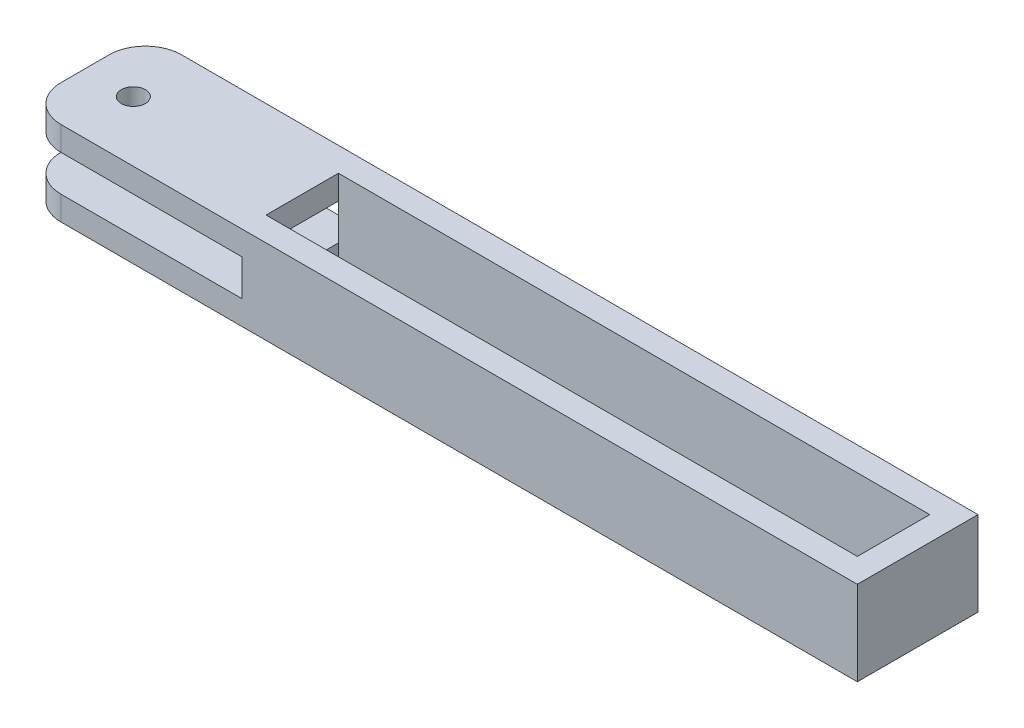
ISO-10303-21;
HEADER;
FILE_DESCRIPTION(('STEP AP214'),'2;1');
FILE_NAME('part.step','',(''),(''),'','','');
FILE_SCHEMA(('AUTOMOTIVE_DESIGN { 1 0 10303 214 1 1 1 1 }'));
ENDSEC;
DATA;
#1=APPLICATION_CONTEXT('core data for automotive mechanical design processes');
#2=APPLICATION_PROTOCOL_DEFINITION('international standard','automotive_design',2000,#1);
#3=PRODUCT_CONTEXT('',#1,'mechanical');
#4=PRODUCT('Part','Part','',(#3));
#5=PRODUCT_RELATED_PRODUCT_CATEGORY('part','',(#4));
#6=PRODUCT_DEFINITION_FORMATION('','',#4);
#7=PRODUCT_DEFINITION_CONTEXT('part definition',#1,'design');
#8=PRODUCT_DEFINITION('design','',#6,#7);
#9=PRODUCT_DEFINITION_SHAPE('','',#8);
#10=(LENGTH_UNIT() NAMED_UNIT(*) SI_UNIT(.MILLI.,.METRE.));
#11=(NAMED_UNIT(*) PLANE_ANGLE_UNIT() SI_UNIT($,.RADIAN.));
#12=(NAMED_UNIT(*) SI_UNIT($,.STERADIAN.) SOLID_ANGLE_UNIT());
#13=UNCERTAINTY_MEASURE_WITH_UNIT(LENGTH_MEASURE(1.E-05),#10,'distance_accuracy_value','');
#14=(GEOMETRIC_REPRESENTATION_CONTEXT(3) GLOBAL_UNCERTAINTY_ASSIGNED_CONTEXT((#13)) GLOBAL_UNIT_ASSIGNED_CONTEXT((#10,
#11,#12)) REPRESENTATION_CONTEXT('',''));
#15=CARTESIAN_POINT('',(0.,0.,0.));
#16=DIRECTION('',(0.,0.,1.));
#17=DIRECTION('',(1.,0.,0.));
#18=AXIS2_PLACEMENT_3D('',#15,#16,#17);
#19=CARTESIAN_POINT('',(-255.,25.,50.));
#20=DIRECTION('',(1.,0.,0.));
#21=DIRECTION('',(0.,0.,-1.));
#22=AXIS2_PLACEMENT_3D('',#19,#20,#21);
#23=PLANE('',#22);
#24=DIRECTION('',(0.,0.,-1.));
#25=VECTOR('',#24,1.);
#26=CARTESIAN_POINT('',(-255.,10.,50.));
#27=LINE('',#26,#25);
#28=CARTESIAN_POINT('',(-255.,10.,10.0000000000001));
#29=VERTEX_POINT('',#28);
#30=CARTESIAN_POINT('',(-255.,10.,0.));
#31=VERTEX_POINT('',#30);
#32=EDGE_CURVE('E265',#29,#31,#27,.T.);
#33=ORIENTED_EDGE('',*,*,#32,.F.);
#34=DIRECTION('',(0.,1.,0.));
#35=VECTOR('',#34,1.);
#36=CARTESIAN_POINT('',(-255.,0.,10.0000000000001));
#37=LINE('',#36,#35);
#38=CARTESIAN_POINT('',(-255.,25.,10.0000000000001));
#39=VERTEX_POINT('',#38);
#40=EDGE_CURVE('E207',#29,#39,#37,.T.);
#41=ORIENTED_EDGE('',*,*,#40,.T.);
#42=DIRECTION('',(0.,0.,-1.));
#43=VECTOR('',#42,1.);
#44=CARTESIAN_POINT('',(-255.,25.,50.));
#45=LINE('',#44,#43);
#46=CARTESIAN_POINT('',(-255.,25.,0.));
#47=VERTEX_POINT('',#46);
#48=EDGE_CURVE('E269',#39,#47,#45,.T.);
#49=ORIENTED_EDGE('',*,*,#48,.T.);
#50=DIRECTION('',(0.,-1.,0.));
#51=VECTOR('',#50,1.);
#52=CARTESIAN_POINT('',(-255.,25.,0.));
#53=LINE('',#52,#51);
#54=EDGE_CURVE('E250',#47,#31,#53,.T.);
#55=ORIENTED_EDGE('',*,*,#54,.T.);
#56=EDGE_LOOP('',(#33,#41,#49,#55));
#57=FACE_BOUND('',#56,.T.);
#58=ADVANCED_FACE('F36',(#57),#23,.F.);
#59=CARTESIAN_POINT('',(0.,0.,50.));
#60=DIRECTION('',(-1.,0.,0.));
#61=DIRECTION('',(0.,0.,1.));
#62=AXIS2_PLACEMENT_3D('',#59,#60,#61);
#63=PLANE('',#62);
#64=DIRECTION('',(0.,1.,0.));
#65=VECTOR('',#64,1.);
#66=CARTESIAN_POINT('',(0.,0.,0.));
#67=LINE('',#66,#65);
#68=CARTESIAN_POINT('',(0.,0.,0.));
#69=VERTEX_POINT('',#68);
#70=CARTESIAN_POINT('',(0.,35.,0.));
#71=VERTEX_POINT('',#70);
#72=EDGE_CURVE('E226',#69,#71,#67,.T.);
#73=ORIENTED_EDGE('',*,*,#72,.T.);
#74=DIRECTION('',(0.,0.,-1.));
#75=VECTOR('',#74,1.);
#76=CARTESIAN_POINT('',(0.,35.,50.));
#77=LINE('',#76,#75);
#78=CARTESIAN_POINT('',(0.,35.,50.));
#79=VERTEX_POINT('',#78);
#80=EDGE_CURVE('E278',#79,#71,#77,.T.);
#81=ORIENTED_EDGE('',*,*,#80,.F.);
#82=DIRECTION('',(0.,1.,0.));
#83=VECTOR('',#82,1.);
#84=CARTESIAN_POINT('',(0.,0.,50.));
#85=LINE('',#84,#83);
#86=CARTESIAN_POINT('',(0.,0.,50.));
#87=VERTEX_POINT('',#86);
#88=EDGE_CURVE('E227',#87,#79,#85,.T.);
#89=ORIENTED_EDGE('',*,*,#88,.F.);
#90=DIRECTION('',(0.,0.,-1.));
#91=VECTOR('',#90,1.);
#92=CARTESIAN_POINT('',(0.,0.,50.));
#93=LINE('',#92,#91);
#94=EDGE_CURVE('E243',#87,#69,#93,.T.);
#95=ORIENTED_EDGE('',*,*,#94,.T.);
#96=EDGE_LOOP('',(#73,#81,#89,#95));
#97=FACE_BOUND('',#96,.T.);
#98=ADVANCED_FACE('F367',(#97),#63,.F.);
#99=CARTESIAN_POINT('',(0.,35.,50.));
#100=DIRECTION('',(0.,-1.,0.));
#101=DIRECTION('',(1.,0.,0.));
#102=AXIS2_PLACEMENT_3D('',#99,#100,#101);
#103=PLANE('',#102);
#104=DIRECTION('',(1.,0.,0.));
#105=VECTOR('',#104,1.);
#106=CARTESIAN_POINT('',(-255.,35.,40.));
#107=LINE('',#106,#105);
#108=CARTESIAN_POINT('',(-255.,35.,40.));
#109=VERTEX_POINT('',#108);
#110=CARTESIAN_POINT('',(-9.99999999999999,35.,40.));
#111=VERTEX_POINT('',#110);
#112=EDGE_CURVE('E199',#109,#111,#107,.T.);
#113=ORIENTED_EDGE('',*,*,#112,.F.);
#114=DIRECTION('',(0.,0.,1.));
#115=VECTOR('',#114,1.);
#116=CARTESIAN_POINT('',(-255.,35.,10.0000000000001));
#117=LINE('',#116,#115);
#118=CARTESIAN_POINT('',(-255.,35.,10.0000000000001));
#119=VERTEX_POINT('',#118);
#120=EDGE_CURVE('E197',#119,#109,#117,.T.);
#121=ORIENTED_EDGE('',*,*,#120,.F.);
#122=DIRECTION('',(-1.,0.,0.));
#123=VECTOR('',#122,1.);
#124=CARTESIAN_POINT('',(-255.,35.,10.0000000000001));
#125=LINE('',#124,#123);
#126=CARTESIAN_POINT('',(-10.,35.,10.));
#127=VERTEX_POINT('',#126);
#128=EDGE_CURVE('E189',#127,#119,#125,.T.);
#129=ORIENTED_EDGE('',*,*,#128,.F.);
#130=DIRECTION('',(0.,0.,-1.));
#131=VECTOR('',#130,1.);
#132=CARTESIAN_POINT('',(-10.,35.,10.));
#133=LINE('',#132,#131);
#134=EDGE_CURVE('E192',#111,#127,#133,.T.);
#135=ORIENTED_EDGE('',*,*,#134,.F.);
#136=EDGE_LOOP('',(#113,#121,#129,#135));
#137=FACE_BOUND('',#136,.T.);
#138=CARTESIAN_POINT('',(-325.,35.,25.));
#139=DIRECTION('',(0.,1.,0.));
#140=DIRECTION('',(-1.,0.,0.));
#141=AXIS2_PLACEMENT_3D('',#138,#139,#140);
#142=CIRCLE('',#141,4.99999999999999);
#143=CARTESIAN_POINT('',(-330.,35.,25.));
#144=VERTEX_POINT('',#143);
#145=EDGE_CURVE('E200',#144,#144,#142,.T.);
#146=ORIENTED_EDGE('',*,*,#145,.F.);
#147=EDGE_LOOP('',(#146));
#148=FACE_BOUND('',#147,.T.);
#149=DIRECTION('',(0.,0.,-1.));
#150=VECTOR('',#149,1.);
#151=CARTESIAN_POINT('',(-345.,35.,50.));
#152=LINE('',#151,#150);
#153=CARTESIAN_POINT('',(-345.,35.,35.));
#154=VERTEX_POINT('',#153);
#155=CARTESIAN_POINT('',(-345.,35.,15.));
#156=VERTEX_POINT('',#155);
#157=EDGE_CURVE('E276',#154,#156,#152,.T.);
#158=ORIENTED_EDGE('',*,*,#157,.F.);
#159=CARTESIAN_POINT('',(-330.,35.,35.));
#160=DIRECTION('',(0.,-1.,0.));
#161=DIRECTION('',(1.,0.,0.));
#162=AXIS2_PLACEMENT_3D('',#159,#160,#161);
#163=CIRCLE('',#162,15.);
#164=CARTESIAN_POINT('',(-330.,35.,50.));
#165=VERTEX_POINT('',#164);
#166=EDGE_CURVE('E310',#154,#165,#163,.F.);
#167=ORIENTED_EDGE('',*,*,#166,.T.);
#168=DIRECTION('',(-1.,0.,0.));
#169=VECTOR('',#168,1.);
#170=CARTESIAN_POINT('',(0.,35.,50.));
#171=LINE('',#170,#169);
#172=EDGE_CURVE('E230',#79,#165,#171,.T.);
#173=ORIENTED_EDGE('',*,*,#172,.F.);
#174=ORIENTED_EDGE('',*,*,#80,.T.);
#175=DIRECTION('',(-1.,0.,0.));
#176=VECTOR('',#175,1.);
#177=CARTESIAN_POINT('',(0.,35.,0.));
#178=LINE('',#177,#176);
#179=CARTESIAN_POINT('',(-330.,35.,0.));
#180=VERTEX_POINT('',#179);
#181=EDGE_CURVE('E246',#71,#180,#178,.T.);
#182=ORIENTED_EDGE('',*,*,#181,.T.);
#183=CARTESIAN_POINT('',(-330.,35.,15.));
#184=DIRECTION('',(0.,-1.,0.));
#185=DIRECTION('',(1.,0.,0.));
#186=AXIS2_PLACEMENT_3D('',#183,#184,#185);
#187=CIRCLE('',#186,15.);
#188=EDGE_CURVE('E57',#180,#156,#187,.F.);
#189=ORIENTED_EDGE('',*,*,#188,.T.);
#190=EDGE_LOOP('',(#158,#167,#173,#174,#182,#189));
#191=FACE_BOUND('',#190,.T.);
#192=ADVANCED_FACE('F312',(#137,#148,#191),#103,.F.);
#193=CARTESIAN_POINT('',(-345.,25.,50.));
#194=DIRECTION('',(1.,0.,0.));
#195=DIRECTION('',(0.,1.,0.));
#196=AXIS2_PLACEMENT_3D('',#193,#194,#195);
#197=PLANE('',#196);
#198=DIRECTION('',(0.,0.,-1.));
#199=VECTOR('',#198,1.);
#200=CARTESIAN_POINT('',(-345.,25.,50.));
#201=LINE('',#200,#199);
#202=CARTESIAN_POINT('',(-345.,25.,35.));
#203=VERTEX_POINT('',#202);
#204=CARTESIAN_POINT('',(-345.,25.,15.));
#205=VERTEX_POINT('',#204);
#206=EDGE_CURVE('E273',#203,#205,#201,.T.);
#207=ORIENTED_EDGE('',*,*,#206,.F.);
#208=DIRECTION('',(0.,-1.,0.));
#209=VECTOR('',#208,1.);
#210=CARTESIAN_POINT('',(-345.,35.,35.));
#211=LINE('',#210,#209);
#212=EDGE_CURVE('E307',#203,#154,#211,.F.);
#213=ORIENTED_EDGE('',*,*,#212,.T.);
#214=ORIENTED_EDGE('',*,*,#157,.T.);
#215=DIRECTION('',(0.,-1.,0.));
#216=VECTOR('',#215,1.);
#217=CARTESIAN_POINT('',(-345.,25.,15.));
#218=LINE('',#217,#216);
#219=EDGE_CURVE('E304',#156,#205,#218,.T.);
#220=ORIENTED_EDGE('',*,*,#219,.T.);
#221=EDGE_LOOP('',(#207,#213,#214,#220));
#222=FACE_BOUND('',#221,.T.);
#223=ADVANCED_FACE('F327',(#222),#197,.F.);
#224=CARTESIAN_POINT('',(-345.,25.,50.));
#225=DIRECTION('',(0.,1.,0.));
#226=DIRECTION('',(-1.,0.,0.));
#227=AXIS2_PLACEMENT_3D('',#224,#225,#226);
#228=PLANE('',#227);
#229=CARTESIAN_POINT('',(-325.,25.,25.));
#230=DIRECTION('',(0.,1.,0.));
#231=DIRECTION('',(-1.,0.,0.));
#232=AXIS2_PLACEMENT_3D('',#229,#230,#231);
#233=CIRCLE('',#232,4.99999999999999);
#234=CARTESIAN_POINT('',(-330.,25.,25.));
#235=VERTEX_POINT('',#234);
#236=EDGE_CURVE('E219',#235,#235,#233,.T.);
#237=ORIENTED_EDGE('',*,*,#236,.T.);
#238=EDGE_LOOP('',(#237));
#239=FACE_BOUND('',#238,.T.);
#240=DIRECTION('',(1.,0.,0.));
#241=VECTOR('',#240,1.);
#242=CARTESIAN_POINT('',(-345.,25.,50.));
#243=LINE('',#242,#241);
#244=CARTESIAN_POINT('',(-330.,25.,50.));
#245=VERTEX_POINT('',#244);
#246=CARTESIAN_POINT('',(-255.,25.,50.));
#247=VERTEX_POINT('',#246);
#248=EDGE_CURVE('E234',#245,#247,#243,.T.);
#249=ORIENTED_EDGE('',*,*,#248,.F.);
#250=CARTESIAN_POINT('',(-330.,25.,35.));
#251=DIRECTION('',(0.,1.,0.));
#252=DIRECTION('',(-1.,0.,0.));
#253=AXIS2_PLACEMENT_3D('',#250,#251,#252);
#254=CIRCLE('',#253,15.);
#255=EDGE_CURVE('E302',#245,#203,#254,.F.);
#256=ORIENTED_EDGE('',*,*,#255,.T.);
#257=ORIENTED_EDGE('',*,*,#206,.T.);
#258=CARTESIAN_POINT('',(-330.,25.,15.));
#259=DIRECTION('',(0.,1.,0.));
#260=DIRECTION('',(-1.,0.,0.));
#261=AXIS2_PLACEMENT_3D('',#258,#259,#260);
#262=CIRCLE('',#261,15.);
#263=CARTESIAN_POINT('',(-330.,25.,0.));
#264=VERTEX_POINT('',#263);
#265=EDGE_CURVE('E300',#205,#264,#262,.F.);
#266=ORIENTED_EDGE('',*,*,#265,.T.);
#267=DIRECTION('',(1.,0.,0.));
#268=VECTOR('',#267,1.);
#269=CARTESIAN_POINT('',(-345.,25.,0.));
#270=LINE('',#269,#268);
#271=EDGE_CURVE('E248',#264,#47,#270,.T.);
#272=ORIENTED_EDGE('',*,*,#271,.T.);
#273=ORIENTED_EDGE('',*,*,#48,.F.);
#274=DIRECTION('',(0.,0.,1.));
#275=VECTOR('',#274,1.);
#276=CARTESIAN_POINT('',(-255.,25.,50.));
#277=LINE('',#276,#275);
#278=CARTESIAN_POINT('',(-255.,25.,40.));
#279=VERTEX_POINT('',#278);
#280=EDGE_CURVE('E223',#39,#279,#277,.T.);
#281=ORIENTED_EDGE('',*,*,#280,.T.);
#282=EDGE_CURVE('E270',#247,#279,#45,.T.);
#283=ORIENTED_EDGE('',*,*,#282,.F.);
#284=EDGE_LOOP('',(#249,#256,#257,#266,#272,#273,#281,#283));
#285=FACE_BOUND('',#284,.T.);
#286=ADVANCED_FACE('F324',(#239,#285),#228,.F.);
#287=ORIENTED_EDGE('',*,*,#282,.T.);
#288=DIRECTION('',(0.,1.,0.));
#289=VECTOR('',#288,1.);
#290=CARTESIAN_POINT('',(-255.,0.,40.));
#291=LINE('',#290,#289);
#292=CARTESIAN_POINT('',(-255.,10.,40.));
#293=VERTEX_POINT('',#292);
#294=EDGE_CURVE('E173',#293,#279,#291,.T.);
#295=ORIENTED_EDGE('',*,*,#294,.F.);
#296=CARTESIAN_POINT('',(-255.,10.,50.));
#297=VERTEX_POINT('',#296);
#298=EDGE_CURVE('E266',#297,#293,#27,.T.);
#299=ORIENTED_EDGE('',*,*,#298,.F.);
#300=DIRECTION('',(0.,-1.,0.));
#301=VECTOR('',#300,1.);
#302=CARTESIAN_POINT('',(-255.,25.,50.));
#303=LINE('',#302,#301);
#304=EDGE_CURVE('E236',#247,#297,#303,.T.);
#305=ORIENTED_EDGE('',*,*,#304,.F.);
#306=EDGE_LOOP('',(#287,#295,#299,#305));
#307=FACE_BOUND('',#306,.T.);
#308=ADVANCED_FACE('F344',(#307),#23,.F.);
#309=CARTESIAN_POINT('',(-255.,10.,50.));
#310=DIRECTION('',(0.,-1.,0.));
#311=DIRECTION('',(1.,0.,0.));
#312=AXIS2_PLACEMENT_3D('',#309,#310,#311);
#313=PLANE('',#312);
#314=CARTESIAN_POINT('',(-325.,9.99999999999999,25.));
#315=DIRECTION('',(0.,-1.,0.));
#316=DIRECTION('',(1.,0.,0.));
#317=AXIS2_PLACEMENT_3D('',#314,#315,#316);
#318=CIRCLE('',#317,4.99999999999999);
#319=CARTESIAN_POINT('',(-320.,9.99999999999999,25.));
#320=VERTEX_POINT('',#319);
#321=EDGE_CURVE('E206',#320,#320,#318,.T.);
#322=ORIENTED_EDGE('',*,*,#321,.T.);
#323=EDGE_LOOP('',(#322));
#324=FACE_BOUND('',#323,.T.);
#325=DIRECTION('',(0.,0.,-1.));
#326=VECTOR('',#325,1.);
#327=CARTESIAN_POINT('',(-345.,9.99999999999999,50.));
#328=LINE('',#327,#326);
#329=CARTESIAN_POINT('',(-345.,9.99999999999999,35.));
#330=VERTEX_POINT('',#329);
#331=CARTESIAN_POINT('',(-345.,9.99999999999999,15.));
#332=VERTEX_POINT('',#331);
#333=EDGE_CURVE('E262',#330,#332,#328,.T.);
#334=ORIENTED_EDGE('',*,*,#333,.F.);
#335=CARTESIAN_POINT('',(-330.,9.99999999999999,35.));
#336=DIRECTION('',(0.,-1.,0.));
#337=DIRECTION('',(1.,0.,0.));
#338=AXIS2_PLACEMENT_3D('',#335,#336,#337);
#339=CIRCLE('',#338,15.);
#340=CARTESIAN_POINT('',(-330.,9.99999999999999,50.));
#341=VERTEX_POINT('',#340);
#342=EDGE_CURVE('E298',#330,#341,#339,.F.);
#343=ORIENTED_EDGE('',*,*,#342,.T.);
#344=DIRECTION('',(-1.,0.,0.));
#345=VECTOR('',#344,1.);
#346=CARTESIAN_POINT('',(-255.,10.,50.));
#347=LINE('',#346,#345);
#348=EDGE_CURVE('E238',#297,#341,#347,.T.);
#349=ORIENTED_EDGE('',*,*,#348,.F.);
#350=ORIENTED_EDGE('',*,*,#298,.T.);
#351=DIRECTION('',(0.,0.,-1.));
#352=VECTOR('',#351,1.);
#353=CARTESIAN_POINT('',(-255.,10.,50.));
#354=LINE('',#353,#352);
#355=EDGE_CURVE('E168',#293,#29,#354,.T.);
#356=ORIENTED_EDGE('',*,*,#355,.T.);
#357=ORIENTED_EDGE('',*,*,#32,.T.);
#358=DIRECTION('',(-1.,0.,0.));
#359=VECTOR('',#358,1.);
#360=CARTESIAN_POINT('',(-255.,10.,0.));
#361=LINE('',#360,#359);
#362=CARTESIAN_POINT('',(-330.,9.99999999999999,0.));
#363=VERTEX_POINT('',#362);
#364=EDGE_CURVE('E253',#31,#363,#361,.T.);
#365=ORIENTED_EDGE('',*,*,#364,.T.);
#366=CARTESIAN_POINT('',(-330.,9.99999999999999,15.));
#367=DIRECTION('',(0.,-1.,0.));
#368=DIRECTION('',(1.,0.,0.));
#369=AXIS2_PLACEMENT_3D('',#366,#367,#368);
#370=CIRCLE('',#369,15.);
#371=EDGE_CURVE('E296',#363,#332,#370,.F.);
#372=ORIENTED_EDGE('',*,*,#371,.T.);
#373=EDGE_LOOP('',(#334,#343,#349,#350,#356,#357,#365,#372));
#374=FACE_BOUND('',#373,.T.);
#375=ADVANCED_FACE('F450',(#324,#374),#313,.F.);
#376=CARTESIAN_POINT('',(-345.,0.,50.));
#377=DIRECTION('',(1.,0.,0.));
#378=DIRECTION('',(0.,1.,0.));
#379=AXIS2_PLACEMENT_3D('',#376,#377,#378);
#380=PLANE('',#379);
#381=DIRECTION('',(0.,0.,-1.));
#382=VECTOR('',#381,1.);
#383=CARTESIAN_POINT('',(-345.,0.,50.));
#384=LINE('',#383,#382);
#385=CARTESIAN_POINT('',(-345.,0.,35.));
#386=VERTEX_POINT('',#385);
#387=CARTESIAN_POINT('',(-345.,0.,15.));
#388=VERTEX_POINT('',#387);
#389=EDGE_CURVE('E259',#386,#388,#384,.T.);
#390=ORIENTED_EDGE('',*,*,#389,.F.);
#391=DIRECTION('',(0.,-1.,0.));
#392=VECTOR('',#391,1.);
#393=CARTESIAN_POINT('',(-345.,9.99999999999999,35.));
#394=LINE('',#393,#392);
#395=EDGE_CURVE('E294',#386,#330,#394,.F.);
#396=ORIENTED_EDGE('',*,*,#395,.T.);
#397=ORIENTED_EDGE('',*,*,#333,.T.);
#398=DIRECTION('',(0.,-1.,0.));
#399=VECTOR('',#398,1.);
#400=CARTESIAN_POINT('',(-345.,0.,15.));
#401=LINE('',#400,#399);
#402=EDGE_CURVE('E291',#332,#388,#401,.T.);
#403=ORIENTED_EDGE('',*,*,#402,.T.);
#404=EDGE_LOOP('',(#390,#396,#397,#403));
#405=FACE_BOUND('',#404,.T.);
#406=ADVANCED_FACE('F358',(#405),#380,.F.);
#407=CARTESIAN_POINT('',(0.,0.,50.));
#408=DIRECTION('',(0.,1.,0.));
#409=DIRECTION('',(-1.,0.,0.));
#410=AXIS2_PLACEMENT_3D('',#407,#408,#409);
#411=PLANE('',#410);
#412=DIRECTION('',(-1.,0.,0.));
#413=VECTOR('',#412,1.);
#414=CARTESIAN_POINT('',(-255.,0.,10.0000000000001));
#415=LINE('',#414,#413);
#416=CARTESIAN_POINT('',(-9.99999999999999,0.,10.));
#417=VERTEX_POINT('',#416);
#418=CARTESIAN_POINT('',(-255.,0.,10.0000000000001));
#419=VERTEX_POINT('',#418);
#420=EDGE_CURVE('E188',#417,#419,#415,.T.);
#421=ORIENTED_EDGE('',*,*,#420,.T.);
#422=DIRECTION('',(0.,0.,1.));
#423=VECTOR('',#422,1.);
#424=CARTESIAN_POINT('',(-255.,0.,10.0000000000001));
#425=LINE('',#424,#423);
#426=CARTESIAN_POINT('',(-255.,0.,40.));
#427=VERTEX_POINT('',#426);
#428=EDGE_CURVE('E165',#419,#427,#425,.T.);
#429=ORIENTED_EDGE('',*,*,#428,.T.);
#430=DIRECTION('',(1.,0.,0.));
#431=VECTOR('',#430,1.);
#432=CARTESIAN_POINT('',(-255.,0.,40.));
#433=LINE('',#432,#431);
#434=CARTESIAN_POINT('',(-9.99999999999999,0.,40.));
#435=VERTEX_POINT('',#434);
#436=EDGE_CURVE('E178',#427,#435,#433,.T.);
#437=ORIENTED_EDGE('',*,*,#436,.T.);
#438=DIRECTION('',(0.,0.,-1.));
#439=VECTOR('',#438,1.);
#440=CARTESIAN_POINT('',(-9.99999999999999,0.,10.));
#441=LINE('',#440,#439);
#442=EDGE_CURVE('E183',#435,#417,#441,.T.);
#443=ORIENTED_EDGE('',*,*,#442,.T.);
#444=EDGE_LOOP('',(#421,#429,#437,#443));
#445=FACE_BOUND('',#444,.T.);
#446=CARTESIAN_POINT('',(-325.,0.,25.));
#447=DIRECTION('',(0.,1.,0.));
#448=DIRECTION('',(-1.,0.,0.));
#449=AXIS2_PLACEMENT_3D('',#446,#447,#448);
#450=CIRCLE('',#449,4.99999999999999);
#451=CARTESIAN_POINT('',(-330.,0.,25.));
#452=VERTEX_POINT('',#451);
#453=EDGE_CURVE('E214',#452,#452,#450,.T.);
#454=ORIENTED_EDGE('',*,*,#453,.T.);
#455=EDGE_LOOP('',(#454));
#456=FACE_BOUND('',#455,.T.);
#457=DIRECTION('',(1.,0.,0.));
#458=VECTOR('',#457,1.);
#459=CARTESIAN_POINT('',(0.,0.,50.));
#460=LINE('',#459,#458);
#461=CARTESIAN_POINT('',(-330.,0.,50.));
#462=VERTEX_POINT('',#461);
#463=EDGE_CURVE('E241',#462,#87,#460,.T.);
#464=ORIENTED_EDGE('',*,*,#463,.F.);
#465=CARTESIAN_POINT('',(-330.,0.,35.));
#466=DIRECTION('',(0.,1.,0.));
#467=DIRECTION('',(-1.,0.,0.));
#468=AXIS2_PLACEMENT_3D('',#465,#466,#467);
#469=CIRCLE('',#468,15.);
#470=EDGE_CURVE('E289',#462,#386,#469,.F.);
#471=ORIENTED_EDGE('',*,*,#470,.T.);
#472=ORIENTED_EDGE('',*,*,#389,.T.);
#473=CARTESIAN_POINT('',(-330.,0.,15.));
#474=DIRECTION('',(0.,1.,0.));
#475=DIRECTION('',(-1.,0.,0.));
#476=AXIS2_PLACEMENT_3D('',#473,#474,#475);
#477=CIRCLE('',#476,15.);
#478=CARTESIAN_POINT('',(-330.,0.,0.));
#479=VERTEX_POINT('',#478);
#480=EDGE_CURVE('E287',#388,#479,#477,.F.);
#481=ORIENTED_EDGE('',*,*,#480,.T.);
#482=DIRECTION('',(1.,0.,0.));
#483=VECTOR('',#482,1.);
#484=CARTESIAN_POINT('',(0.,0.,0.));
#485=LINE('',#484,#483);
#486=EDGE_CURVE('E231',#479,#69,#485,.T.);
#487=ORIENTED_EDGE('',*,*,#486,.T.);
#488=ORIENTED_EDGE('',*,*,#94,.F.);
#489=EDGE_LOOP('',(#464,#471,#472,#481,#487,#488));
#490=FACE_BOUND('',#489,.T.);
#491=ADVANCED_FACE('F185',(#445,#456,#490),#411,.F.);
#492=CARTESIAN_POINT('',(0.,0.,50.));
#493=DIRECTION('',(0.,0.,1.));
#494=DIRECTION('',(1.,0.,0.));
#495=AXIS2_PLACEMENT_3D('',#492,#493,#494);
#496=PLANE('',#495);
#497=ORIENTED_EDGE('',*,*,#348,.T.);
#498=DIRECTION('',(0.,-1.,0.));
#499=VECTOR('',#498,1.);
#500=CARTESIAN_POINT('',(-330.,0.,50.));
#501=LINE('',#500,#499);
#502=EDGE_CURVE('E284',#341,#462,#501,.T.);
#503=ORIENTED_EDGE('',*,*,#502,.T.);
#504=ORIENTED_EDGE('',*,*,#463,.T.);
#505=ORIENTED_EDGE('',*,*,#88,.T.);
#506=ORIENTED_EDGE('',*,*,#172,.T.);
#507=DIRECTION('',(0.,-1.,0.));
#508=VECTOR('',#507,1.);
#509=CARTESIAN_POINT('',(-330.,24.9999999999999,50.));
#510=LINE('',#509,#508);
#511=EDGE_CURVE('E281',#165,#245,#510,.T.);
#512=ORIENTED_EDGE('',*,*,#511,.T.);
#513=ORIENTED_EDGE('',*,*,#248,.T.);
#514=ORIENTED_EDGE('',*,*,#304,.T.);
#515=EDGE_LOOP('',(#497,#503,#504,#505,#506,#512,#513,#514));
#516=FACE_BOUND('',#515,.T.);
#517=ADVANCED_FACE('F317',(#516),#496,.T.);
#518=CARTESIAN_POINT('',(0.,0.,0.));
#519=DIRECTION('',(0.,0.,1.));
#520=DIRECTION('',(1.,0.,0.));
#521=AXIS2_PLACEMENT_3D('',#518,#519,#520);
#522=PLANE('',#521);
#523=ORIENTED_EDGE('',*,*,#486,.F.);
#524=DIRECTION('',(0.,-1.,0.));
#525=VECTOR('',#524,1.);
#526=CARTESIAN_POINT('',(-330.,-1.8318679906315E-12,0.));
#527=LINE('',#526,#525);
#528=EDGE_CURVE('E11',#479,#363,#527,.F.);
#529=ORIENTED_EDGE('',*,*,#528,.T.);
#530=ORIENTED_EDGE('',*,*,#364,.F.);
#531=ORIENTED_EDGE('',*,*,#54,.F.);
#532=ORIENTED_EDGE('',*,*,#271,.F.);
#533=DIRECTION('',(0.,-1.,0.));
#534=VECTOR('',#533,1.);
#535=CARTESIAN_POINT('',(-330.,1.8318679906315E-12,0.));
#536=LINE('',#535,#534);
#537=EDGE_CURVE('E44',#264,#180,#536,.F.);
#538=ORIENTED_EDGE('',*,*,#537,.T.);
#539=ORIENTED_EDGE('',*,*,#181,.F.);
#540=ORIENTED_EDGE('',*,*,#72,.F.);
#541=EDGE_LOOP('',(#523,#529,#530,#531,#532,#538,#539,#540));
#542=FACE_BOUND('',#541,.T.);
#543=ADVANCED_FACE('F334',(#542),#522,.F.);
#544=CARTESIAN_POINT('',(-325.,0.,25.));
#545=DIRECTION('',(0.,1.,0.));
#546=DIRECTION('',(-1.,0.,0.));
#547=AXIS2_PLACEMENT_3D('',#544,#545,#546);
#548=CYLINDRICAL_SURFACE('',#547,4.99999999999999);
#549=ORIENTED_EDGE('',*,*,#453,.F.);
#550=EDGE_LOOP('',(#549));
#551=FACE_BOUND('',#550,.T.);
#552=ORIENTED_EDGE('',*,*,#321,.F.);
#553=EDGE_LOOP('',(#552));
#554=FACE_BOUND('',#553,.T.);
#555=ADVANCED_FACE('F420',(#551,#554),#548,.F.);
#556=CARTESIAN_POINT('',(-255.,0.,10.0000000000001));
#557=DIRECTION('',(-1.,0.,0.));
#558=DIRECTION('',(0.,-1.,0.));
#559=AXIS2_PLACEMENT_3D('',#556,#557,#558);
#560=PLANE('',#559);
#561=EDGE_CURVE('E208',#39,#119,#37,.T.);
#562=ORIENTED_EDGE('',*,*,#561,.T.);
#563=ORIENTED_EDGE('',*,*,#120,.T.);
#564=EDGE_CURVE('E175',#279,#109,#291,.T.);
#565=ORIENTED_EDGE('',*,*,#564,.F.);
#566=ORIENTED_EDGE('',*,*,#280,.F.);
#567=EDGE_LOOP('',(#562,#563,#565,#566));
#568=FACE_BOUND('',#567,.T.);
#569=ADVANCED_FACE('F537',(#568),#560,.F.);
#570=EDGE_CURVE('E161',#427,#293,#291,.T.);
#571=ORIENTED_EDGE('',*,*,#570,.F.);
#572=ORIENTED_EDGE('',*,*,#428,.F.);
#573=EDGE_CURVE('E204',#419,#29,#37,.T.);
#574=ORIENTED_EDGE('',*,*,#573,.T.);
#575=ORIENTED_EDGE('',*,*,#355,.F.);
#576=EDGE_LOOP('',(#571,#572,#574,#575));
#577=FACE_BOUND('',#576,.T.);
#578=ADVANCED_FACE('F163',(#577),#560,.F.);
#579=CARTESIAN_POINT('',(-255.,0.,10.0000000000001));
#580=DIRECTION('',(0.,0.,-1.));
#581=DIRECTION('',(-1.,0.,0.));
#582=AXIS2_PLACEMENT_3D('',#579,#580,#581);
#583=PLANE('',#582);
#584=ORIENTED_EDGE('',*,*,#128,.T.);
#585=ORIENTED_EDGE('',*,*,#561,.F.);
#586=ORIENTED_EDGE('',*,*,#40,.F.);
#587=ORIENTED_EDGE('',*,*,#573,.F.);
#588=ORIENTED_EDGE('',*,*,#420,.F.);
#589=DIRECTION('',(0.,1.,0.));
#590=VECTOR('',#589,1.);
#591=CARTESIAN_POINT('',(-9.99999999999999,0.,10.));
#592=LINE('',#591,#590);
#593=EDGE_CURVE('E209',#417,#127,#592,.T.);
#594=ORIENTED_EDGE('',*,*,#593,.T.);
#595=EDGE_LOOP('',(#584,#585,#586,#587,#588,#594));
#596=FACE_BOUND('',#595,.T.);
#597=ADVANCED_FACE('F516',(#596),#583,.F.);
#598=CARTESIAN_POINT('',(-9.99999999999999,0.,10.));
#599=DIRECTION('',(1.,0.,0.));
#600=DIRECTION('',(0.,1.,0.));
#601=AXIS2_PLACEMENT_3D('',#598,#599,#600);
#602=PLANE('',#601);
#603=ORIENTED_EDGE('',*,*,#134,.T.);
#604=ORIENTED_EDGE('',*,*,#593,.F.);
#605=ORIENTED_EDGE('',*,*,#442,.F.);
#606=DIRECTION('',(0.,1.,0.));
#607=VECTOR('',#606,1.);
#608=CARTESIAN_POINT('',(-9.99999999999999,0.,40.));
#609=LINE('',#608,#607);
#610=EDGE_CURVE('E172',#435,#111,#609,.T.);
#611=ORIENTED_EDGE('',*,*,#610,.T.);
#612=EDGE_LOOP('',(#603,#604,#605,#611));
#613=FACE_BOUND('',#612,.T.);
#614=ADVANCED_FACE('F506',(#613),#602,.F.);
#615=CARTESIAN_POINT('',(-255.,0.,40.));
#616=DIRECTION('',(0.,0.,1.));
#617=DIRECTION('',(1.,0.,0.));
#618=AXIS2_PLACEMENT_3D('',#615,#616,#617);
#619=PLANE('',#618);
#620=ORIENTED_EDGE('',*,*,#112,.T.);
#621=ORIENTED_EDGE('',*,*,#610,.F.);
#622=ORIENTED_EDGE('',*,*,#436,.F.);
#623=ORIENTED_EDGE('',*,*,#570,.T.);
#624=ORIENTED_EDGE('',*,*,#294,.T.);
#625=ORIENTED_EDGE('',*,*,#564,.T.);
#626=EDGE_LOOP('',(#620,#621,#622,#623,#624,#625));
#627=FACE_BOUND('',#626,.T.);
#628=ADVANCED_FACE('F180',(#627),#619,.F.);
#629=ORIENTED_EDGE('',*,*,#145,.T.);
#630=EDGE_LOOP('',(#629));
#631=FACE_BOUND('',#630,.T.);
#632=ORIENTED_EDGE('',*,*,#236,.F.);
#633=EDGE_LOOP('',(#632));
#634=FACE_BOUND('',#633,.T.);
#635=ADVANCED_FACE('F381',(#631,#634),#548,.F.);
#636=CARTESIAN_POINT('',(-330.,-1.8318679906315E-12,35.));
#637=DIRECTION('',(0.,1.,0.));
#638=DIRECTION('',(-1.,0.,0.));
#639=AXIS2_PLACEMENT_3D('',#636,#637,#638);
#640=CYLINDRICAL_SURFACE('',#639,15.);
#641=ORIENTED_EDGE('',*,*,#342,.F.);
#642=ORIENTED_EDGE('',*,*,#395,.F.);
#643=ORIENTED_EDGE('',*,*,#470,.F.);
#644=ORIENTED_EDGE('',*,*,#502,.F.);
#645=EDGE_LOOP('',(#641,#642,#643,#644));
#646=FACE_BOUND('',#645,.T.);
#647=ADVANCED_FACE('F352',(#646),#640,.T.);
#648=CARTESIAN_POINT('',(-330.,1.8318679906315E-12,35.));
#649=DIRECTION('',(0.,1.,0.));
#650=DIRECTION('',(-1.,0.,0.));
#651=AXIS2_PLACEMENT_3D('',#648,#649,#650);
#652=CYLINDRICAL_SURFACE('',#651,15.);
#653=ORIENTED_EDGE('',*,*,#166,.F.);
#654=ORIENTED_EDGE('',*,*,#212,.F.);
#655=ORIENTED_EDGE('',*,*,#255,.F.);
#656=ORIENTED_EDGE('',*,*,#511,.F.);
#657=EDGE_LOOP('',(#653,#654,#655,#656));
#658=FACE_BOUND('',#657,.T.);
#659=ADVANCED_FACE('F321',(#658),#652,.T.);
#660=CARTESIAN_POINT('',(-330.,0.,15.));
#661=DIRECTION('',(0.,-1.,0.));
#662=DIRECTION('',(1.,0.,0.));
#663=AXIS2_PLACEMENT_3D('',#660,#661,#662);
#664=CYLINDRICAL_SURFACE('',#663,15.);
#665=ORIENTED_EDGE('',*,*,#371,.F.);
#666=ORIENTED_EDGE('',*,*,#528,.F.);
#667=ORIENTED_EDGE('',*,*,#480,.F.);
#668=ORIENTED_EDGE('',*,*,#402,.F.);
#669=EDGE_LOOP('',(#665,#666,#667,#668));
#670=FACE_BOUND('',#669,.T.);
#671=ADVANCED_FACE('F363',(#670),#664,.T.);
#672=CARTESIAN_POINT('',(-330.,24.9999999999999,15.));
#673=DIRECTION('',(0.,-1.,0.));
#674=DIRECTION('',(1.,0.,0.));
#675=AXIS2_PLACEMENT_3D('',#672,#673,#674);
#676=CYLINDRICAL_SURFACE('',#675,15.);
#677=ORIENTED_EDGE('',*,*,#188,.F.);
#678=ORIENTED_EDGE('',*,*,#537,.F.);
#679=ORIENTED_EDGE('',*,*,#265,.F.);
#680=ORIENTED_EDGE('',*,*,#219,.F.);
#681=EDGE_LOOP('',(#677,#678,#679,#680));
#682=FACE_BOUND('',#681,.T.);
#683=ADVANCED_FACE('F38',(#682),#676,.T.);
#684=CLOSED_SHELL('',(#58,#98,#192,#223,#286,#308,#375,#406,#491,#517,#543,#555,#569,#578,#597,
#614,#628,#635,#647,#659,#671,#683));
#685=MANIFOLD_SOLID_BREP('B2',#684);
#686=ADVANCED_BREP_SHAPE_REPRESENTATION('',(#18,#685),#14);
#687=SHAPE_DEFINITION_REPRESENTATION(#9,#686);
ENDSEC;
END-ISO-10303-21;
